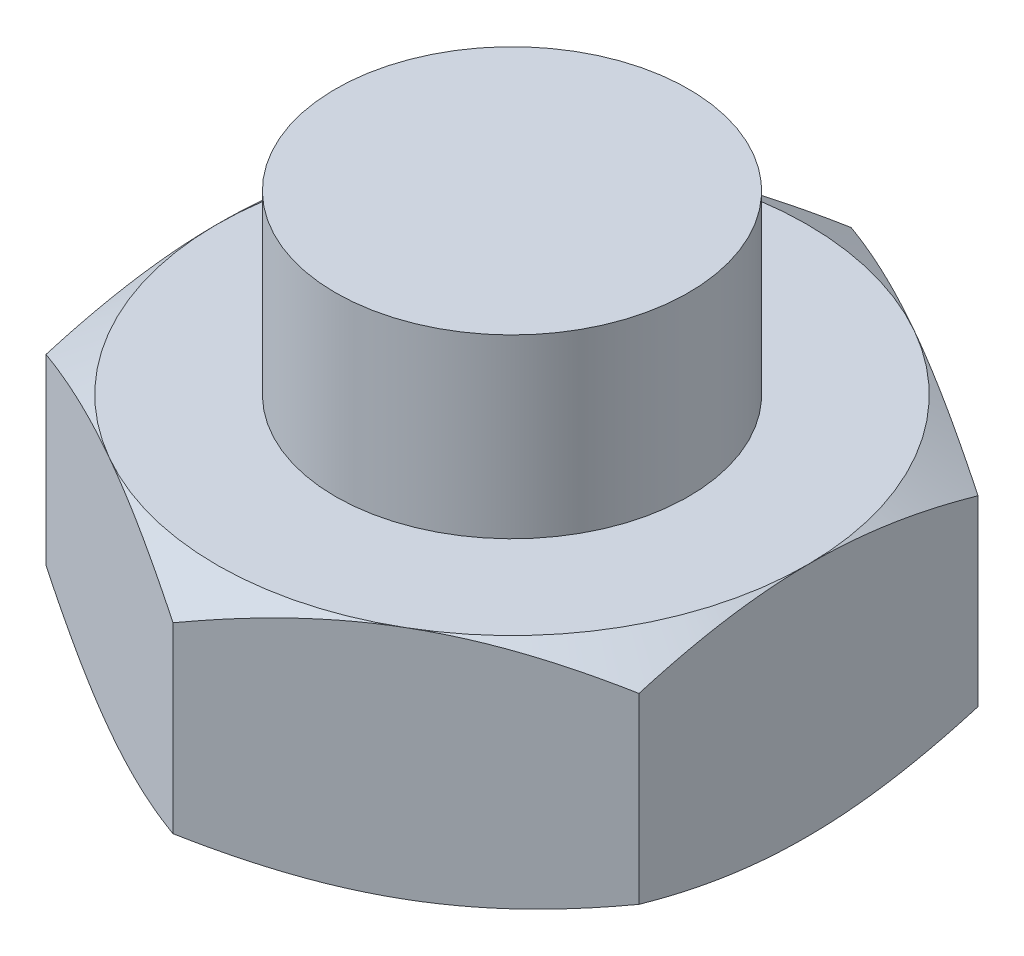
ISO-10303-21;
HEADER;
FILE_DESCRIPTION(('STEP AP214'),'2;1');
FILE_NAME('part.step','',(''),(''),'','','');
FILE_SCHEMA(('AUTOMOTIVE_DESIGN { 1 0 10303 214 1 1 1 1 }'));
ENDSEC;
DATA;
#1=APPLICATION_CONTEXT('core data for automotive mechanical design processes');
#2=APPLICATION_PROTOCOL_DEFINITION('international standard','automotive_design',2000,#1);
#3=PRODUCT_CONTEXT('',#1,'mechanical');
#4=PRODUCT('Part','Part','',(#3));
#5=PRODUCT_RELATED_PRODUCT_CATEGORY('part','',(#4));
#6=PRODUCT_DEFINITION_FORMATION('','',#4);
#7=PRODUCT_DEFINITION_CONTEXT('part definition',#1,'design');
#8=PRODUCT_DEFINITION('design','',#6,#7);
#9=PRODUCT_DEFINITION_SHAPE('','',#8);
#10=(LENGTH_UNIT() NAMED_UNIT(*) SI_UNIT(.MILLI.,.METRE.));
#11=(NAMED_UNIT(*) PLANE_ANGLE_UNIT() SI_UNIT($,.RADIAN.));
#12=(NAMED_UNIT(*) SI_UNIT($,.STERADIAN.) SOLID_ANGLE_UNIT());
#13=UNCERTAINTY_MEASURE_WITH_UNIT(LENGTH_MEASURE(1.E-05),#10,'distance_accuracy_value','');
#14=(GEOMETRIC_REPRESENTATION_CONTEXT(3) GLOBAL_UNCERTAINTY_ASSIGNED_CONTEXT((#13)) GLOBAL_UNIT_ASSIGNED_CONTEXT((#10,
#11,#12)) REPRESENTATION_CONTEXT('',''));
#15=CARTESIAN_POINT('',(0.,0.,0.));
#16=DIRECTION('',(0.,0.,1.));
#17=DIRECTION('',(1.,0.,0.));
#18=AXIS2_PLACEMENT_3D('',#15,#16,#17);
#19=CARTESIAN_POINT('',(0.,4.,0.));
#20=DIRECTION('',(0.,1.,0.));
#21=DIRECTION('',(0.,0.,1.));
#22=AXIS2_PLACEMENT_3D('',#19,#20,#21);
#23=PLANE('',#22);
#24=CARTESIAN_POINT('',(0.,4.,0.));
#25=DIRECTION('',(0.,1.,0.));
#26=DIRECTION('',(0.,0.,1.));
#27=AXIS2_PLACEMENT_3D('',#24,#25,#26);
#28=CIRCLE('',#27,5.01430599676595);
#29=CARTESIAN_POINT('',(-2.48575470841264,4.,4.35480058772011));
#30=VERTEX_POINT('',#29);
#31=CARTESIAN_POINT('',(2.5284905831747,4.,4.33012701892218));
#32=VERTEX_POINT('',#31);
#33=EDGE_CURVE('E171',#30,#32,#28,.T.);
#34=ORIENTED_EDGE('',*,*,#33,.T.);
#35=CARTESIAN_POINT('',(0.,4.,0.));
#36=DIRECTION('',(0.,1.,0.));
#37=DIRECTION('',(0.,0.,1.));
#38=AXIS2_PLACEMENT_3D('',#35,#36,#37);
#39=CIRCLE('',#38,5.01430599676595);
#40=CARTESIAN_POINT('',(5.01424529158734,4.,-0.0246735687979292));
#41=VERTEX_POINT('',#40);
#42=EDGE_CURVE('E252',#32,#41,#39,.T.);
#43=ORIENTED_EDGE('',*,*,#42,.T.);
#44=CARTESIAN_POINT('',(2.48575470841264,4.,-4.35480058772011));
#45=VERTEX_POINT('',#44);
#46=EDGE_CURVE('E173',#41,#45,#28,.T.);
#47=ORIENTED_EDGE('',*,*,#46,.T.);
#48=CARTESIAN_POINT('',(-2.5284905831747,4.,-4.33012701892218));
#49=VERTEX_POINT('',#48);
#50=EDGE_CURVE('E180',#45,#49,#28,.T.);
#51=ORIENTED_EDGE('',*,*,#50,.T.);
#52=CARTESIAN_POINT('',(-5.01424529158734,4.,0.02467356879793));
#53=VERTEX_POINT('',#52);
#54=EDGE_CURVE('E178',#49,#53,#28,.T.);
#55=ORIENTED_EDGE('',*,*,#54,.T.);
#56=EDGE_CURVE('E172',#53,#30,#28,.T.);
#57=ORIENTED_EDGE('',*,*,#56,.T.);
#58=EDGE_LOOP('',(#34,#43,#47,#51,#55,#57));
#59=FACE_BOUND('',#58,.T.);
#60=CARTESIAN_POINT('',(0.,4.,0.));
#61=DIRECTION('',(0.,1.,0.));
#62=DIRECTION('',(0.,0.,1.));
#63=AXIS2_PLACEMENT_3D('',#60,#61,#62);
#64=CIRCLE('',#63,3.);
#65=CARTESIAN_POINT('',(0.,4.,3.));
#66=VERTEX_POINT('',#65);
#67=EDGE_CURVE('E483',#66,#66,#64,.T.);
#68=ORIENTED_EDGE('',*,*,#67,.F.);
#69=EDGE_LOOP('',(#68));
#70=FACE_BOUND('',#69,.T.);
#71=ADVANCED_FACE('F35',(#59,#70),#23,.T.);
#72=CARTESIAN_POINT('',(5.02849058317469,4.,2.87030230008283));
#73=DIRECTION('',(-0.999987893603092,0.,0.00492063484235761));
#74=DIRECTION('',(0.00492063484235761,0.,0.999987893603092));
#75=AXIS2_PLACEMENT_3D('',#72,#73,#74);
#76=PLANE('',#75);
#77=CARTESIAN_POINT('',(4.9999990158611,0.447917484700277,-2.91984943767869));
#78=CARTESIAN_POINT('',(5.00125108658539,0.374446528137613,-2.66539943146302));
#79=CARTESIAN_POINT('',(5.00251386630712,0.307621421446591,-2.40877310691777));
#80=CARTESIAN_POINT('',(5.00506129162112,0.190977949349087,-1.89107680238245));
#81=CARTESIAN_POINT('',(5.00634598247228,0.14120084471822,-1.62999762472705));
#82=CARTESIAN_POINT('',(5.00889963872586,0.0637294768664885,-1.11103504778139));
#83=CARTESIAN_POINT('',(5.01016820644773,0.0355191827968383,-0.853232466462973));
#84=CARTESIAN_POINT('',(5.01207552012836,0.0102227694877358,-0.465621792020172));
#85=CARTESIAN_POINT('',(5.01271172642389,0.00462573641110162,-0.336329817762157));
#86=CARTESIAN_POINT('',(5.01398472688311,-0.000800215533808021,-0.0776264007129085));
#87=CARTESIAN_POINT('',(5.01462152102803,-0.000629312581884306,0.0517850382643947));
#88=CARTESIAN_POINT('',(5.01636613881153,0.00777692395854868,0.406332107566666));
#89=CARTESIAN_POINT('',(5.01747338430081,0.0218934907406079,0.631350244454539));
#90=CARTESIAN_POINT('',(5.01968052664195,0.0666562759325538,1.07989310351669));
#91=CARTESIAN_POINT('',(5.02078041573633,0.0973177942957524,1.30341624919304));
#92=CARTESIAN_POINT('',(5.02299200456623,0.173963342665548,1.75286273859509));
#93=CARTESIAN_POINT('',(5.0241034251966,0.220272131434008,1.97872936163798));
#94=CARTESIAN_POINT('',(5.02630969163108,0.325374511175889,2.42709421601792));
#95=CARTESIAN_POINT('',(5.02740456569219,0.384143412596234,2.6495981898347));
#96=CARTESIAN_POINT('',(5.02849156731357,0.447917484700276,2.87050230008283));
#97=B_SPLINE_CURVE_WITH_KNOTS('',3,(#77,#78,#79,#80,#81,#82,#83,#84,#85,#86,#87,#88,#89,#90,#91,
#92,#93,#94,#95,#96),.UNSPECIFIED.,.F.,.F.,(4,2,2,2,2,2,2,2,2,4),(0.,0.794821338024906,
1.59155298495652,2.36856665618577,2.75669843208432,3.14481821804768,3.82050145746416,
4.49681060885583,5.18811978674575,5.87807173689202),.UNSPECIFIED.);
#98=CARTESIAN_POINT('',(4.99999999999998,0.447859747478655,-2.91964943767869));
#99=VERTEX_POINT('',#98);
#100=CARTESIAN_POINT('',(5.01424529158734,0.,-0.0246735687979292));
#101=VERTEX_POINT('',#100);
#102=EDGE_CURVE('E52',#99,#101,#97,.T.);
#103=ORIENTED_EDGE('',*,*,#102,.F.);
#104=DIRECTION('',(0.,-1.,0.));
#105=VECTOR('',#104,1.);
#106=CARTESIAN_POINT('',(4.99999999999998,4.,-2.91964943767869));
#107=LINE('',#106,#105);
#108=CARTESIAN_POINT('',(4.99999999999998,3.55214025252135,-2.91964943767869));
#109=VERTEX_POINT('',#108);
#110=EDGE_CURVE('E169',#109,#99,#107,.T.);
#111=ORIENTED_EDGE('',*,*,#110,.F.);
#112=CARTESIAN_POINT('',(5.02849156731357,3.55208251529972,2.87050230008283));
#113=CARTESIAN_POINT('',(5.02723949658928,3.62555347186239,2.61605229386716));
#114=CARTESIAN_POINT('',(5.02597671686755,3.69237857855341,2.35942596932191));
#115=CARTESIAN_POINT('',(5.02342929155355,3.80902205065091,1.84172966478659));
#116=CARTESIAN_POINT('',(5.02214460070239,3.85879915528178,1.58065048713119));
#117=CARTESIAN_POINT('',(5.01959094444881,3.93627052313351,1.06168791018553));
#118=CARTESIAN_POINT('',(5.01832237672694,3.96448081720316,0.803885328867112));
#119=CARTESIAN_POINT('',(5.01641506304631,3.98977723051226,0.416274654424311));
#120=CARTESIAN_POINT('',(5.01577885675078,3.9953742635889,0.286982680166297));
#121=CARTESIAN_POINT('',(5.01450585629156,4.00080021553381,0.028279263117048));
#122=CARTESIAN_POINT('',(5.01386906214664,4.00062931258188,-0.101132175860255));
#123=CARTESIAN_POINT('',(5.01212444436314,3.99222307604145,-0.455679245162526));
#124=CARTESIAN_POINT('',(5.01101719887386,3.97810650925939,-0.680697382050399));
#125=CARTESIAN_POINT('',(5.00881005653272,3.93334372406745,-1.12924024111255));
#126=CARTESIAN_POINT('',(5.00771016743834,3.90268220570425,-1.3527633867889));
#127=CARTESIAN_POINT('',(5.00549857860844,3.82603665733445,-1.80220987619095));
#128=CARTESIAN_POINT('',(5.00438715797807,3.77972786856599,-2.02807649923384));
#129=CARTESIAN_POINT('',(5.00218089154359,3.67462548882411,-2.47644135361378));
#130=CARTESIAN_POINT('',(5.00108601748248,3.61585658740377,-2.69894532743056));
#131=CARTESIAN_POINT('',(4.9999990158611,3.55208251529972,-2.91984943767869));
#132=B_SPLINE_CURVE_WITH_KNOTS('',3,(#112,#113,#114,#115,#116,#117,#118,#119,#120,#121,#122,
#123,#124,#125,#126,#127,#128,#129,#130,#131),.UNSPECIFIED.,.F.,.F.,(4,2,2,2,2,2,2,2,2,4),(0.,
0.794821338024905,1.59155298495652,2.36856665618577,2.75669843208432,3.14481821804768,
3.82050145746416,4.49681060885583,5.18811978674575,5.87807173689202),.UNSPECIFIED.);
#133=EDGE_CURVE('E239',#41,#109,#132,.T.);
#134=ORIENTED_EDGE('',*,*,#133,.F.);
#135=CARTESIAN_POINT('',(5.02849058317469,3.55214025252135,2.87030230008283));
#136=VERTEX_POINT('',#135);
#137=EDGE_CURVE('E160',#136,#41,#132,.T.);
#138=ORIENTED_EDGE('',*,*,#137,.F.);
#139=DIRECTION('',(0.,-1.,0.));
#140=VECTOR('',#139,1.);
#141=CARTESIAN_POINT('',(5.02849058317469,4.,2.87030230008283));
#142=LINE('',#141,#140);
#143=CARTESIAN_POINT('',(5.02849058317469,0.447859747478654,2.87030230008283));
#144=VERTEX_POINT('',#143);
#145=EDGE_CURVE('E155',#136,#144,#142,.T.);
#146=ORIENTED_EDGE('',*,*,#145,.T.);
#147=EDGE_CURVE('E147',#101,#144,#97,.T.);
#148=ORIENTED_EDGE('',*,*,#147,.F.);
#149=EDGE_LOOP('',(#103,#111,#134,#138,#146,#148));
#150=FACE_BOUND('',#149,.T.);
#151=ADVANCED_FACE('F37',(#150),#76,.F.);
#152=CARTESIAN_POINT('',(4.99999999999998,4.,-2.91964943767869));
#153=DIRECTION('',(-0.495732552025317,0.,0.868475236758347));
#154=DIRECTION('',(0.868475236758347,0.,0.495732552025317));
#155=AXIS2_PLACEMENT_3D('',#152,#153,#154);
#156=PLANE('',#155);
#157=CARTESIAN_POINT('',(-0.0286905831747077,0.447926228072088,-5.79006589934749));
#158=CARTESIAN_POINT('',(0.192296065465768,0.374454553334258,-5.66392496791119));
#159=CARTESIAN_POINT('',(0.415172818406593,0.307628683938442,-5.53670514995199));
#160=CARTESIAN_POINT('',(0.864785619640762,0.190983628851342,-5.28006259764271));
#161=CARTESIAN_POINT('',(1.09152965626008,0.141205704931097,-5.15063530349282));
#162=CARTESIAN_POINT('',(1.54224222213373,0.0637327171769791,-4.89336499680635));
#163=CARTESIAN_POINT('',(1.76614056016625,0.0355216175545699,-4.76556204997579));
#164=CARTESIAN_POINT('',(2.1027756546474,0.0102240367495575,-4.57340806857809));
#165=CARTESIAN_POINT('',(2.21506414638369,0.00462662144995524,-4.50931290706343));
#166=CARTESIAN_POINT('',(2.43974490113167,-0.000800072082288288,-4.38106335056723));
#167=CARTESIAN_POINT('',(2.5521371608308,-0.000629528483201749,-4.31690895747652));
#168=CARTESIAN_POINT('',(2.86006040720272,0.00777586246854357,-4.1411439266604));
#169=CARTESIAN_POINT('',(3.05548936155995,0.0218922835307172,-4.02959152978981));
#170=CARTESIAN_POINT('',(3.44505022864037,0.0666554626951286,-3.80722709769868));
#171=CARTESIAN_POINT('',(3.63918077207081,0.0973175223166123,-3.69641584408132));
#172=CARTESIAN_POINT('',(4.02952650777377,0.173964760147534,-3.47360340275655));
#173=CARTESIAN_POINT('',(4.22569243550712,0.220274718850526,-3.36163033563878));
#174=CARTESIAN_POINT('',(4.61509875558895,0.325379883010159,-3.13935412019999));
#175=CARTESIAN_POINT('',(4.80834413567574,0.384150396705421,-3.02904812483839));
#176=CARTESIAN_POINT('',(5.00019999999998,0.447926228072089,-2.91953527609272));
#177=B_SPLINE_CURVE_WITH_KNOTS('',3,(#157,#158,#159,#160,#161,#162,#163,#164,#165,#166,#167,
#168,#169,#170,#171,#172,#173,#174,#175,#176),.UNSPECIFIED.,.F.,.F.,(4,2,2,2,2,2,2,2,2,4),(0.,
0.794823411774109,1.59155718924444,2.36857273607155,2.75670543860724,3.1448261520024,
3.82052279419409,4.49684539888776,5.18816874193885,5.87813475679396),.UNSPECIFIED.);
#178=CARTESIAN_POINT('',(-0.0284905831747079,0.447859747478655,-5.78995173776152));
#179=VERTEX_POINT('',#178);
#180=CARTESIAN_POINT('',(2.48575470841264,0.,-4.35480058772011));
#181=VERTEX_POINT('',#180);
#182=EDGE_CURVE('E59',#179,#181,#177,.T.);
#183=ORIENTED_EDGE('',*,*,#182,.F.);
#184=DIRECTION('',(0.,-1.,0.));
#185=VECTOR('',#184,1.);
#186=CARTESIAN_POINT('',(-0.0284905831747077,4.,-5.78995173776152));
#187=LINE('',#186,#185);
#188=CARTESIAN_POINT('',(-0.0284905831747076,3.55214025252135,-5.78995173776152));
#189=VERTEX_POINT('',#188);
#190=EDGE_CURVE('E166',#189,#179,#187,.T.);
#191=ORIENTED_EDGE('',*,*,#190,.F.);
#192=CARTESIAN_POINT('',(5.00019999999998,3.55207377192791,-2.91953527609272));
#193=CARTESIAN_POINT('',(4.7792133513595,3.62554544666574,-3.04567620752903));
#194=CARTESIAN_POINT('',(4.55633659841868,3.69237131606156,-3.17289602548823));
#195=CARTESIAN_POINT('',(4.10672379718451,3.80901637114866,-3.42953857779751));
#196=CARTESIAN_POINT('',(3.8799797605652,3.8587942950689,-3.55896587194739));
#197=CARTESIAN_POINT('',(3.42926719469154,3.93626728282302,-3.81623617863386));
#198=CARTESIAN_POINT('',(3.20536885665902,3.96447838244543,-3.94403912546443));
#199=CARTESIAN_POINT('',(2.86873376217788,3.98977596325044,-4.13619310686212));
#200=CARTESIAN_POINT('',(2.75644527044158,3.99537337855004,-4.20028826837678));
#201=CARTESIAN_POINT('',(2.5317645156936,4.00080007208229,-4.32853782487298));
#202=CARTESIAN_POINT('',(2.41937225599447,4.0006295284832,-4.39269221796369));
#203=CARTESIAN_POINT('',(2.11144900962255,3.99222413753146,-4.56845724877982));
#204=CARTESIAN_POINT('',(1.91602005526533,3.97810771646928,-4.68000964565041));
#205=CARTESIAN_POINT('',(1.5264591881849,3.93334453730487,-4.90237407774153));
#206=CARTESIAN_POINT('',(1.33232864475447,3.90268247768339,-5.0131853313589));
#207=CARTESIAN_POINT('',(0.941982909051504,3.82603523985247,-5.23599777268366));
#208=CARTESIAN_POINT('',(0.745816981318151,3.77972528114947,-5.34797083980144));
#209=CARTESIAN_POINT('',(0.356410661236327,3.67462011698984,-5.57024705524022));
#210=CARTESIAN_POINT('',(0.163165281149531,3.61584960329458,-5.68055305060182));
#211=CARTESIAN_POINT('',(-0.0286905831747084,3.55207377192791,-5.79006589934749));
#212=B_SPLINE_CURVE_WITH_KNOTS('',3,(#192,#193,#194,#195,#196,#197,#198,#199,#200,#201,#202,
#203,#204,#205,#206,#207,#208,#209,#210,#211),.UNSPECIFIED.,.F.,.F.,(4,2,2,2,2,2,2,2,2,4),(0.,
0.794823411774109,1.59155718924444,2.36857273607156,2.75670543860725,3.1448261520024,
3.82052279419409,4.49684539888776,5.18816874193885,5.87813475679396),.UNSPECIFIED.);
#213=EDGE_CURVE('E293',#45,#189,#212,.T.);
#214=ORIENTED_EDGE('',*,*,#213,.F.);
#215=EDGE_CURVE('E297',#109,#45,#212,.T.);
#216=ORIENTED_EDGE('',*,*,#215,.F.);
#217=ORIENTED_EDGE('',*,*,#110,.T.);
#218=EDGE_CURVE('E277',#181,#99,#177,.T.);
#219=ORIENTED_EDGE('',*,*,#218,.F.);
#220=EDGE_LOOP('',(#183,#191,#214,#216,#217,#219));
#221=FACE_BOUND('',#220,.T.);
#222=ADVANCED_FACE('F286',(#221),#156,.F.);
#223=CARTESIAN_POINT('',(-0.0284905831747077,4.,-5.78995173776152));
#224=DIRECTION('',(0.504255341577775,0.,0.863554601915989));
#225=DIRECTION('',(0.863554601915989,0.,-0.504255341577775));
#226=AXIS2_PLACEMENT_3D('',#223,#224,#225);
#227=PLANE('',#226);
#228=CARTESIAN_POINT('',(-5.02869058317469,0.447926606897626,-2.87018551410532));
#229=CARTESIAN_POINT('',(-4.8089559886495,0.374454901043448,-2.99849511117412));
#230=CARTESIAN_POINT('',(-4.58734199871511,0.307628998601953,-3.12790214339286));
#231=CARTESIAN_POINT('',(-4.14027658772118,0.190983874928712,-3.38895699855567));
#232=CARTESIAN_POINT('',(-3.91481722358392,0.141205915511134,-3.52060945970022));
#233=CARTESIAN_POINT('',(-3.46665827795118,0.0637328575715192,-3.78230286242168));
#234=CARTESIAN_POINT('',(-3.2440284900705,0.0355217230469225,-3.91230304942095));
#235=CARTESIAN_POINT('',(-2.90930068132805,0.010224091657783,-4.10776062113501));
#236=CARTESIAN_POINT('',(-2.79764838636964,0.00462665979759133,-4.17295773317319));
#237=CARTESIAN_POINT('',(-2.5742406125009,-0.000800065865445418,-4.30341220944297));
#238=CARTESIAN_POINT('',(-2.46248513688438,-0.000629537836063153,-4.36866957175122));
#239=CARTESIAN_POINT('',(-2.15630635232406,0.00777581647830405,-4.54745651498536));
#240=CARTESIAN_POINT('',(-1.96198449720749,0.0218922312264838,-4.66092685398932));
#241=CARTESIAN_POINT('',(-1.574630481177,0.0666554274600818,-4.88711444100652));
#242=CARTESIAN_POINT('',(-1.38159968180313,0.0973175105325956,-4.99983089397584));
#243=CARTESIAN_POINT('',(-0.993465240699849,0.173964821562911,-5.22647419451803));
#244=CARTESIAN_POINT('',(-0.798410584532968,0.220274830955858,-5.34037243795688));
#245=CARTESIAN_POINT('',(-0.411210237815937,0.325380115756476,-5.56647029286915));
#246=CARTESIAN_POINT('',(-0.21905958776662,0.384150699307086,-5.67867280034237));
#247=CARTESIAN_POINT('',(-0.0282905831747069,0.447926606897628,-5.79006852373903));
#248=B_SPLINE_CURVE_WITH_KNOTS('',3,(#228,#229,#230,#231,#232,#233,#234,#235,#236,#237,#238,
#239,#240,#241,#242,#243,#244,#245,#246,#247),.UNSPECIFIED.,.F.,.F.,(4,2,2,2,2,2,2,2,2,4),(0.,
0.794823501623766,1.59155737140428,2.36857299949575,2.75670574218,3.14482649575815,
3.82052371865139,4.49684690623585,5.18817086302087,5.8781374872575),.UNSPECIFIED.);
#249=CARTESIAN_POINT('',(-5.02849058317469,0.447859747478653,-2.87030230008283));
#250=VERTEX_POINT('',#249);
#251=CARTESIAN_POINT('',(-2.5284905831747,0.,-4.33012701892218));
#252=VERTEX_POINT('',#251);
#253=EDGE_CURVE('E306',#250,#252,#248,.T.);
#254=ORIENTED_EDGE('',*,*,#253,.F.);
#255=DIRECTION('',(0.,-1.,0.));
#256=VECTOR('',#255,1.);
#257=CARTESIAN_POINT('',(-5.02849058317469,4.,-2.87030230008283));
#258=LINE('',#257,#256);
#259=CARTESIAN_POINT('',(-5.02849058317469,3.55214025252135,-2.87030230008283));
#260=VERTEX_POINT('',#259);
#261=EDGE_CURVE('E157',#260,#250,#258,.T.);
#262=ORIENTED_EDGE('',*,*,#261,.F.);
#263=CARTESIAN_POINT('',(-0.0282905831747075,3.55207339310237,-5.79006852373903));
#264=CARTESIAN_POINT('',(-0.248025177699891,3.62554509895655,-5.66175892667023));
#265=CARTESIAN_POINT('',(-0.469639167634286,3.69237100139805,-5.53235189445149));
#266=CARTESIAN_POINT('',(-0.916704578628218,3.80901612507129,-5.27129703928868));
#267=CARTESIAN_POINT('',(-1.14216394276548,3.85879408448887,-5.13964457814413));
#268=CARTESIAN_POINT('',(-1.59032288839821,3.93626714242848,-4.87795117542267));
#269=CARTESIAN_POINT('',(-1.81295267627889,3.96447827695308,-4.7479509884234));
#270=CARTESIAN_POINT('',(-2.14768048502134,3.98977590834222,-4.55249341670934));
#271=CARTESIAN_POINT('',(-2.25933277997976,3.99537334020241,-4.48729630467116));
#272=CARTESIAN_POINT('',(-2.4827405538485,4.00080006586545,-4.35684182840138));
#273=CARTESIAN_POINT('',(-2.59449602946501,4.00062953783606,-4.29158446609313));
#274=CARTESIAN_POINT('',(-2.90067481402534,3.9922241835217,-4.11279752285899));
#275=CARTESIAN_POINT('',(-3.09499666914191,3.97810776877352,-3.99932718385503));
#276=CARTESIAN_POINT('',(-3.4823506851724,3.93334457253992,-3.77313959683783));
#277=CARTESIAN_POINT('',(-3.67538148454626,3.90268248946741,-3.66042314386851));
#278=CARTESIAN_POINT('',(-4.06351592564955,3.82603517843709,-3.43377984332632));
#279=CARTESIAN_POINT('',(-4.25857058181643,3.77972516904414,-3.31988159988747));
#280=CARTESIAN_POINT('',(-4.64577092853346,3.67461988424353,-3.0937837449752));
#281=CARTESIAN_POINT('',(-4.83792157858278,3.61584930069292,-2.98158123750198));
#282=CARTESIAN_POINT('',(-5.02869058317469,3.55207339310237,-2.87018551410532));
#283=B_SPLINE_CURVE_WITH_KNOTS('',3,(#263,#264,#265,#266,#267,#268,#269,#270,#271,#272,#273,
#274,#275,#276,#277,#278,#279,#280,#281,#282),.UNSPECIFIED.,.F.,.F.,(4,2,2,2,2,2,2,2,2,4),(0.,
0.794823501623766,1.59155737140428,2.36857299949575,2.75670574218,3.14482649575815,
3.82052371865139,4.49684690623585,5.18817086302087,5.8781374872575),.UNSPECIFIED.);
#284=EDGE_CURVE('E205',#49,#260,#283,.T.);
#285=ORIENTED_EDGE('',*,*,#284,.F.);
#286=EDGE_CURVE('E298',#189,#49,#283,.T.);
#287=ORIENTED_EDGE('',*,*,#286,.F.);
#288=ORIENTED_EDGE('',*,*,#190,.T.);
#289=EDGE_CURVE('E282',#252,#179,#248,.T.);
#290=ORIENTED_EDGE('',*,*,#289,.F.);
#291=EDGE_LOOP('',(#254,#262,#285,#287,#288,#290));
#292=FACE_BOUND('',#291,.T.);
#293=ADVANCED_FACE('F289',(#292),#227,.F.);
#294=CARTESIAN_POINT('',(-5.02849058317469,4.,-2.87030230008283));
#295=DIRECTION('',(0.999987893603092,0.,-0.00492063484235776));
#296=DIRECTION('',(-0.00492063484235776,0.,-0.999987893603092));
#297=AXIS2_PLACEMENT_3D('',#294,#295,#296);
#298=PLANE('',#297);
#299=CARTESIAN_POINT('',(-4.9999990158611,0.447917484700276,2.91984943767869));
#300=CARTESIAN_POINT('',(-5.00125108658539,0.374446528137612,2.66539943146302));
#301=CARTESIAN_POINT('',(-5.00251386630712,0.30762142144659,2.40877310691777));
#302=CARTESIAN_POINT('',(-5.00506129162112,0.190977949349086,1.89107680238245));
#303=CARTESIAN_POINT('',(-5.00634598247228,0.14120084471822,1.62999762472705));
#304=CARTESIAN_POINT('',(-5.00889963872586,0.0637294768664876,1.11103504778139));
#305=CARTESIAN_POINT('',(-5.01016820644773,0.0355191827968375,0.853232466462975));
#306=CARTESIAN_POINT('',(-5.01207552012836,0.010222769487735,0.465621792020174));
#307=CARTESIAN_POINT('',(-5.01271172642389,0.00462573641110095,0.336329817762159));
#308=CARTESIAN_POINT('',(-5.01398472688311,-0.000800215533808893,0.0776264007129104));
#309=CARTESIAN_POINT('',(-5.01462152102803,-0.000629312581885465,-0.0517850382643928));
#310=CARTESIAN_POINT('',(-5.01636613881153,0.00777692395854731,-0.406332107566664));
#311=CARTESIAN_POINT('',(-5.01747338430081,0.0218934907406071,-0.631350244454537));
#312=CARTESIAN_POINT('',(-5.01968052664194,0.0666562759325533,-1.07989310351668));
#313=CARTESIAN_POINT('',(-5.02078041573633,0.0973177942957519,-1.30341624919304));
#314=CARTESIAN_POINT('',(-5.02299200456623,0.173963342665548,-1.75286273859509));
#315=CARTESIAN_POINT('',(-5.0241034251966,0.220272131434007,-1.97872936163798));
#316=CARTESIAN_POINT('',(-5.02630969163108,0.325374511175888,-2.42709421601792));
#317=CARTESIAN_POINT('',(-5.02740456569219,0.384143412596232,-2.64959818983469));
#318=CARTESIAN_POINT('',(-5.02849156731357,0.447917484700275,-2.87050230008283));
#319=B_SPLINE_CURVE_WITH_KNOTS('',3,(#299,#300,#301,#302,#303,#304,#305,#306,#307,#308,#309,
#310,#311,#312,#313,#314,#315,#316,#317,#318),.UNSPECIFIED.,.F.,.F.,(4,2,2,2,2,2,2,2,2,4),(0.,
0.794821338024906,1.59155298495652,2.36856665618577,2.75669843208432,3.14481821804768,
3.82050145746416,4.49681060885583,5.18811978674575,5.87807173689202),.UNSPECIFIED.);
#320=CARTESIAN_POINT('',(-4.99999999999998,0.447859747478655,2.91964943767869));
#321=VERTEX_POINT('',#320);
#322=CARTESIAN_POINT('',(-5.01424529158734,0.,0.02467356879793));
#323=VERTEX_POINT('',#322);
#324=EDGE_CURVE('E272',#321,#323,#319,.T.);
#325=ORIENTED_EDGE('',*,*,#324,.F.);
#326=DIRECTION('',(0.,-1.,0.));
#327=VECTOR('',#326,1.);
#328=CARTESIAN_POINT('',(-4.99999999999998,4.,2.91964943767869));
#329=LINE('',#328,#327);
#330=CARTESIAN_POINT('',(-4.99999999999998,3.55214025252135,2.91964943767869));
#331=VERTEX_POINT('',#330);
#332=EDGE_CURVE('E154',#331,#321,#329,.T.);
#333=ORIENTED_EDGE('',*,*,#332,.F.);
#334=CARTESIAN_POINT('',(-5.02849156731357,3.55208251529973,-2.87050230008283));
#335=CARTESIAN_POINT('',(-5.02723949658928,3.62555347186239,-2.61605229386716));
#336=CARTESIAN_POINT('',(-5.02597671686755,3.69237857855341,-2.3594259693219));
#337=CARTESIAN_POINT('',(-5.02342929155355,3.80902205065091,-1.84172966478659));
#338=CARTESIAN_POINT('',(-5.02214460070239,3.85879915528178,-1.58065048713119));
#339=CARTESIAN_POINT('',(-5.01959094444881,3.93627052313351,-1.06168791018552));
#340=CARTESIAN_POINT('',(-5.01832237672694,3.96448081720316,-0.80388532886711));
#341=CARTESIAN_POINT('',(-5.01641506304631,3.98977723051227,-0.41627465442431));
#342=CARTESIAN_POINT('',(-5.01577885675077,3.9953742635889,-0.286982680166295));
#343=CARTESIAN_POINT('',(-5.01450585629156,4.00080021553381,-0.0282792631170463));
#344=CARTESIAN_POINT('',(-5.01386906214664,4.00062931258188,0.101132175860257));
#345=CARTESIAN_POINT('',(-5.01212444436314,3.99222307604145,0.455679245162528));
#346=CARTESIAN_POINT('',(-5.01101719887385,3.97810650925939,0.680697382050401));
#347=CARTESIAN_POINT('',(-5.00881005653272,3.93334372406745,1.12924024111255));
#348=CARTESIAN_POINT('',(-5.00771016743834,3.90268220570425,1.3527633867889));
#349=CARTESIAN_POINT('',(-5.00549857860844,3.82603665733445,1.80220987619095));
#350=CARTESIAN_POINT('',(-5.00438715797807,3.77972786856599,2.02807649923384));
#351=CARTESIAN_POINT('',(-5.00218089154358,3.67462548882411,2.47644135361379));
#352=CARTESIAN_POINT('',(-5.00108601748248,3.61585658740377,2.69894532743056));
#353=CARTESIAN_POINT('',(-4.9999990158611,3.55208251529972,2.91984943767869));
#354=B_SPLINE_CURVE_WITH_KNOTS('',3,(#334,#335,#336,#337,#338,#339,#340,#341,#342,#343,#344,
#345,#346,#347,#348,#349,#350,#351,#352,#353),.UNSPECIFIED.,.F.,.F.,(4,2,2,2,2,2,2,2,2,4),(0.,
0.794821338024905,1.59155298495652,2.36856665618577,2.75669843208432,3.14481821804768,
3.82050145746416,4.49681060885583,5.18811978674575,5.87807173689202),.UNSPECIFIED.);
#355=EDGE_CURVE('E196',#53,#331,#354,.T.);
#356=ORIENTED_EDGE('',*,*,#355,.F.);
#357=EDGE_CURVE('E199',#260,#53,#354,.T.);
#358=ORIENTED_EDGE('',*,*,#357,.F.);
#359=ORIENTED_EDGE('',*,*,#261,.T.);
#360=EDGE_CURVE('E278',#323,#250,#319,.T.);
#361=ORIENTED_EDGE('',*,*,#360,.F.);
#362=EDGE_LOOP('',(#325,#333,#356,#358,#359,#361));
#363=FACE_BOUND('',#362,.T.);
#364=ADVANCED_FACE('F198',(#363),#298,.F.);
#365=CARTESIAN_POINT('',(-4.99999999999998,4.,2.91964943767869));
#366=DIRECTION('',(0.495732552025317,0.,-0.868475236758347));
#367=DIRECTION('',(-0.868475236758347,0.,-0.495732552025317));
#368=AXIS2_PLACEMENT_3D('',#365,#366,#367);
#369=PLANE('',#368);
#370=CARTESIAN_POINT('',(0.0286905831747081,0.447926228072088,5.79006589934749));
#371=CARTESIAN_POINT('',(-0.192296065465768,0.374454553334259,5.66392496791119));
#372=CARTESIAN_POINT('',(-0.415172818406594,0.307628683938443,5.53670514995199));
#373=CARTESIAN_POINT('',(-0.864785619640762,0.190983628851342,5.28006259764271));
#374=CARTESIAN_POINT('',(-1.09152965626008,0.141205704931096,5.15063530349282));
#375=CARTESIAN_POINT('',(-1.54224222213373,0.063732717176979,4.89336499680635));
#376=CARTESIAN_POINT('',(-1.76614056016625,0.0355216175545702,4.76556204997579));
#377=CARTESIAN_POINT('',(-2.1027756546474,0.0102240367495579,4.57340806857809));
#378=CARTESIAN_POINT('',(-2.21506414638369,0.00462662144995558,4.50931290706343));
#379=CARTESIAN_POINT('',(-2.43974490113167,-0.000800072082288124,4.38106335056723));
#380=CARTESIAN_POINT('',(-2.5521371608308,-0.000629528483201724,4.31690895747652));
#381=CARTESIAN_POINT('',(-2.86006040720272,0.00777586246854352,4.1411439266604));
#382=CARTESIAN_POINT('',(-3.05548936155995,0.0218922835307175,4.02959152978981));
#383=CARTESIAN_POINT('',(-3.44505022864037,0.066655462695129,3.80722709769868));
#384=CARTESIAN_POINT('',(-3.6391807720708,0.0973175223166124,3.69641584408132));
#385=CARTESIAN_POINT('',(-4.02952650777377,0.173964760147534,3.47360340275656));
#386=CARTESIAN_POINT('',(-4.22569243550712,0.220274718850525,3.36163033563878));
#387=CARTESIAN_POINT('',(-4.61509875558894,0.325379883010158,3.13935412019999));
#388=CARTESIAN_POINT('',(-4.80834413567574,0.38415039670542,3.02904812483839));
#389=CARTESIAN_POINT('',(-5.00019999999998,0.447926228072088,2.91953527609272));
#390=B_SPLINE_CURVE_WITH_KNOTS('',3,(#370,#371,#372,#373,#374,#375,#376,#377,#378,#379,#380,
#381,#382,#383,#384,#385,#386,#387,#388,#389),.UNSPECIFIED.,.F.,.F.,(4,2,2,2,2,2,2,2,2,4),(0.,
0.794823411774109,1.59155718924444,2.36857273607155,2.75670543860724,3.1448261520024,
3.82052279419409,4.49684539888776,5.18816874193885,5.87813475679396),.UNSPECIFIED.);
#391=CARTESIAN_POINT('',(0.0284905831747081,0.447859747478655,5.78995173776152));
#392=VERTEX_POINT('',#391);
#393=CARTESIAN_POINT('',(-2.48575470841264,0.,4.35480058772011));
#394=VERTEX_POINT('',#393);
#395=EDGE_CURVE('E130',#392,#394,#390,.T.);
#396=ORIENTED_EDGE('',*,*,#395,.F.);
#397=DIRECTION('',(0.,-1.,0.));
#398=VECTOR('',#397,1.);
#399=CARTESIAN_POINT('',(0.0284905831747081,4.,5.78995173776152));
#400=LINE('',#399,#398);
#401=CARTESIAN_POINT('',(0.0284905831747081,3.55214025252134,5.78995173776152));
#402=VERTEX_POINT('',#401);
#403=EDGE_CURVE('E144',#402,#392,#400,.T.);
#404=ORIENTED_EDGE('',*,*,#403,.F.);
#405=CARTESIAN_POINT('',(-5.00019999999998,3.55207377192791,2.91953527609272));
#406=CARTESIAN_POINT('',(-4.7792133513595,3.62554544666574,3.04567620752903));
#407=CARTESIAN_POINT('',(-4.55633659841868,3.69237131606156,3.17289602548823));
#408=CARTESIAN_POINT('',(-4.10672379718451,3.80901637114866,3.42953857779751));
#409=CARTESIAN_POINT('',(-3.8799797605652,3.8587942950689,3.55896587194739));
#410=CARTESIAN_POINT('',(-3.42926719469154,3.93626728282302,3.81623617863387));
#411=CARTESIAN_POINT('',(-3.20536885665902,3.96447838244543,3.94403912546443));
#412=CARTESIAN_POINT('',(-2.86873376217787,3.98977596325044,4.13619310686212));
#413=CARTESIAN_POINT('',(-2.75644527044158,3.99537337855004,4.20028826837678));
#414=CARTESIAN_POINT('',(-2.5317645156936,4.00080007208229,4.32853782487298));
#415=CARTESIAN_POINT('',(-2.41937225599447,4.0006295284832,4.39269221796369));
#416=CARTESIAN_POINT('',(-2.11144900962255,3.99222413753146,4.56845724877982));
#417=CARTESIAN_POINT('',(-1.91602005526533,3.97810771646928,4.68000964565041));
#418=CARTESIAN_POINT('',(-1.5264591881849,3.93334453730487,4.90237407774153));
#419=CARTESIAN_POINT('',(-1.33232864475447,3.90268247768339,5.01318533135889));
#420=CARTESIAN_POINT('',(-0.941982909051503,3.82603523985247,5.23599777268366));
#421=CARTESIAN_POINT('',(-0.745816981318151,3.77972528114947,5.34797083980144));
#422=CARTESIAN_POINT('',(-0.356410661236327,3.67462011698984,5.57024705524022));
#423=CARTESIAN_POINT('',(-0.163165281149531,3.61584960329458,5.68055305060182));
#424=CARTESIAN_POINT('',(0.0286905831747086,3.55207377192791,5.79006589934749));
#425=B_SPLINE_CURVE_WITH_KNOTS('',3,(#405,#406,#407,#408,#409,#410,#411,#412,#413,#414,#415,
#416,#417,#418,#419,#420,#421,#422,#423,#424),.UNSPECIFIED.,.F.,.F.,(4,2,2,2,2,2,2,2,2,4),(0.,
0.794823411774109,1.59155718924444,2.36857273607155,2.75670543860724,3.1448261520024,
3.82052279419408,4.49684539888776,5.18816874193885,5.87813475679396),.UNSPECIFIED.);
#426=EDGE_CURVE('E206',#30,#402,#425,.T.);
#427=ORIENTED_EDGE('',*,*,#426,.F.);
#428=EDGE_CURVE('E203',#331,#30,#425,.T.);
#429=ORIENTED_EDGE('',*,*,#428,.F.);
#430=ORIENTED_EDGE('',*,*,#332,.T.);
#431=EDGE_CURVE('E146',#394,#321,#390,.T.);
#432=ORIENTED_EDGE('',*,*,#431,.F.);
#433=EDGE_LOOP('',(#396,#404,#427,#429,#430,#432));
#434=FACE_BOUND('',#433,.T.);
#435=ADVANCED_FACE('F142',(#434),#369,.F.);
#436=CARTESIAN_POINT('',(0.0284905831747081,4.,5.78995173776152));
#437=DIRECTION('',(-0.504255341577775,0.,-0.863554601915989));
#438=DIRECTION('',(-0.863554601915989,0.,0.504255341577775));
#439=AXIS2_PLACEMENT_3D('',#436,#437,#438);
#440=PLANE('',#439);
#441=CARTESIAN_POINT('',(5.02869058317469,0.447926606897627,2.87018551410532));
#442=CARTESIAN_POINT('',(4.8089559886495,0.374454901043449,2.99849511117413));
#443=CARTESIAN_POINT('',(4.58734199871511,0.307628998601954,3.12790214339286));
#444=CARTESIAN_POINT('',(4.14027658772118,0.190983874928713,3.38895699855567));
#445=CARTESIAN_POINT('',(3.91481722358392,0.141205915511135,3.52060945970022));
#446=CARTESIAN_POINT('',(3.46665827795118,0.0637328575715202,3.78230286242168));
#447=CARTESIAN_POINT('',(3.2440284900705,0.0355217230469236,3.91230304942095));
#448=CARTESIAN_POINT('',(2.90930068132805,0.0102240916577841,4.10776062113501));
#449=CARTESIAN_POINT('',(2.79764838636963,0.00462665979759228,4.17295773317319));
#450=CARTESIAN_POINT('',(2.5742406125009,-0.000800065865444331,4.30341220944297));
#451=CARTESIAN_POINT('',(2.46248513688438,-0.000629537836061869,4.36866957175123));
#452=CARTESIAN_POINT('',(2.15630635232406,0.0077758164783056,4.54745651498537));
#453=CARTESIAN_POINT('',(1.96198449720748,0.0218922312264852,4.66092685398932));
#454=CARTESIAN_POINT('',(1.57463048117699,0.066655427460083,4.88711444100653));
#455=CARTESIAN_POINT('',(1.38159968180313,0.0973175105325968,4.99983089397584));
#456=CARTESIAN_POINT('',(0.993465240699848,0.173964821562912,5.22647419451803));
#457=CARTESIAN_POINT('',(0.798410584532968,0.220274830955859,5.34037243795688));
#458=CARTESIAN_POINT('',(0.411210237815937,0.325380115756476,5.56647029286915));
#459=CARTESIAN_POINT('',(0.21905958776662,0.384150699307086,5.67867280034237));
#460=CARTESIAN_POINT('',(0.0282905831747073,0.447926606897628,5.79006852373903));
#461=B_SPLINE_CURVE_WITH_KNOTS('',3,(#441,#442,#443,#444,#445,#446,#447,#448,#449,#450,#451,
#452,#453,#454,#455,#456,#457,#458,#459,#460),.UNSPECIFIED.,.F.,.F.,(4,2,2,2,2,2,2,2,2,4),(0.,
0.794823501623766,1.59155737140428,2.36857299949575,2.75670574218,3.14482649575815,
3.82052371865139,4.49684690623585,5.18817086302087,5.8781374872575),.UNSPECIFIED.);
#462=CARTESIAN_POINT('',(2.5284905831747,0.,4.33012701892218));
#463=VERTEX_POINT('',#462);
#464=EDGE_CURVE('E136',#144,#463,#461,.T.);
#465=ORIENTED_EDGE('',*,*,#464,.F.);
#466=ORIENTED_EDGE('',*,*,#145,.F.);
#467=CARTESIAN_POINT('',(0.0282905831747079,3.55207339310237,5.79006852373903));
#468=CARTESIAN_POINT('',(0.248025177699892,3.62554509895655,5.66175892667023));
#469=CARTESIAN_POINT('',(0.469639167634287,3.69237100139805,5.53235189445149));
#470=CARTESIAN_POINT('',(0.916704578628219,3.80901612507129,5.27129703928868));
#471=CARTESIAN_POINT('',(1.14216394276548,3.85879408448886,5.13964457814413));
#472=CARTESIAN_POINT('',(1.59032288839821,3.93626714242848,4.87795117542268));
#473=CARTESIAN_POINT('',(1.81295267627889,3.96447827695308,4.7479509884234));
#474=CARTESIAN_POINT('',(2.14768048502134,3.98977590834222,4.55249341670934));
#475=CARTESIAN_POINT('',(2.25933277997976,3.99537334020241,4.48729630467116));
#476=CARTESIAN_POINT('',(2.4827405538485,4.00080006586544,4.35684182840138));
#477=CARTESIAN_POINT('',(2.59449602946501,4.00062953783606,4.29158446609313));
#478=CARTESIAN_POINT('',(2.90067481402534,3.9922241835217,4.11279752285899));
#479=CARTESIAN_POINT('',(3.09499666914191,3.97810776877352,3.99932718385503));
#480=CARTESIAN_POINT('',(3.4823506851724,3.93334457253992,3.77313959683783));
#481=CARTESIAN_POINT('',(3.67538148454627,3.9026824894674,3.66042314386851));
#482=CARTESIAN_POINT('',(4.06351592564955,3.82603517843709,3.43377984332633));
#483=CARTESIAN_POINT('',(4.25857058181643,3.77972516904414,3.31988159988748));
#484=CARTESIAN_POINT('',(4.64577092853346,3.67461988424352,3.0937837449752));
#485=CARTESIAN_POINT('',(4.83792157858278,3.61584930069291,2.98158123750198));
#486=CARTESIAN_POINT('',(5.02869058317469,3.55207339310237,2.87018551410532));
#487=B_SPLINE_CURVE_WITH_KNOTS('',3,(#467,#468,#469,#470,#471,#472,#473,#474,#475,#476,#477,
#478,#479,#480,#481,#482,#483,#484,#485,#486),.UNSPECIFIED.,.F.,.F.,(4,2,2,2,2,2,2,2,2,4),(0.,
0.794823501623766,1.59155737140428,2.36857299949575,2.75670574218,3.14482649575815,
3.82052371865139,4.49684690623585,5.18817086302087,5.8781374872575),.UNSPECIFIED.);
#488=EDGE_CURVE('E245',#32,#136,#487,.T.);
#489=ORIENTED_EDGE('',*,*,#488,.F.);
#490=EDGE_CURVE('E153',#402,#32,#487,.T.);
#491=ORIENTED_EDGE('',*,*,#490,.F.);
#492=ORIENTED_EDGE('',*,*,#403,.T.);
#493=EDGE_CURVE('E127',#463,#392,#461,.T.);
#494=ORIENTED_EDGE('',*,*,#493,.F.);
#495=EDGE_LOOP('',(#465,#466,#489,#491,#492,#494));
#496=FACE_BOUND('',#495,.T.);
#497=ADVANCED_FACE('F150',(#496),#440,.F.);
#498=CARTESIAN_POINT('',(0.,4.,0.));
#499=DIRECTION('',(0.,-1.,0.));
#500=DIRECTION('',(0.,0.,1.));
#501=AXIS2_PLACEMENT_3D('',#498,#499,#500);
#502=CONICAL_SURFACE('',#501,5.01430599676595,1.0471975511966);
#503=ORIENTED_EDGE('',*,*,#426,.T.);
#504=ORIENTED_EDGE('',*,*,#490,.T.);
#505=ORIENTED_EDGE('',*,*,#33,.F.);
#506=EDGE_LOOP('',(#503,#504,#505));
#507=FACE_BOUND('',#506,.T.);
#508=ADVANCED_FACE('F232',(#507),#502,.T.);
#509=ORIENTED_EDGE('',*,*,#355,.T.);
#510=ORIENTED_EDGE('',*,*,#428,.T.);
#511=ORIENTED_EDGE('',*,*,#56,.F.);
#512=EDGE_LOOP('',(#509,#510,#511));
#513=FACE_BOUND('',#512,.T.);
#514=ADVANCED_FACE('F324',(#513),#502,.T.);
#515=ORIENTED_EDGE('',*,*,#284,.T.);
#516=ORIENTED_EDGE('',*,*,#357,.T.);
#517=ORIENTED_EDGE('',*,*,#54,.F.);
#518=EDGE_LOOP('',(#515,#516,#517));
#519=FACE_BOUND('',#518,.T.);
#520=ADVANCED_FACE('F301',(#519),#502,.T.);
#521=ORIENTED_EDGE('',*,*,#213,.T.);
#522=ORIENTED_EDGE('',*,*,#286,.T.);
#523=ORIENTED_EDGE('',*,*,#50,.F.);
#524=EDGE_LOOP('',(#521,#522,#523));
#525=FACE_BOUND('',#524,.T.);
#526=ADVANCED_FACE('F318',(#525),#502,.T.);
#527=ORIENTED_EDGE('',*,*,#133,.T.);
#528=ORIENTED_EDGE('',*,*,#215,.T.);
#529=ORIENTED_EDGE('',*,*,#46,.F.);
#530=EDGE_LOOP('',(#527,#528,#529));
#531=FACE_BOUND('',#530,.T.);
#532=ADVANCED_FACE('F230',(#531),#502,.T.);
#533=ORIENTED_EDGE('',*,*,#137,.T.);
#534=ORIENTED_EDGE('',*,*,#42,.F.);
#535=ORIENTED_EDGE('',*,*,#488,.T.);
#536=EDGE_LOOP('',(#533,#534,#535));
#537=FACE_BOUND('',#536,.T.);
#538=ADVANCED_FACE('F225',(#537),#502,.T.);
#539=CARTESIAN_POINT('',(0.,0.,0.));
#540=DIRECTION('',(0.,1.,0.));
#541=DIRECTION('',(0.,0.,-1.));
#542=AXIS2_PLACEMENT_3D('',#539,#540,#541);
#543=CONICAL_SURFACE('',#542,5.01430599676595,1.0471975511966);
#544=ORIENTED_EDGE('',*,*,#395,.T.);
#545=CARTESIAN_POINT('',(0.,0.,0.));
#546=DIRECTION('',(0.,1.,0.));
#547=DIRECTION('',(0.,0.,1.));
#548=AXIS2_PLACEMENT_3D('',#545,#546,#547);
#549=CIRCLE('',#548,5.01430599676595);
#550=EDGE_CURVE('E40',#394,#463,#549,.T.);
#551=ORIENTED_EDGE('',*,*,#550,.T.);
#552=ORIENTED_EDGE('',*,*,#493,.T.);
#553=EDGE_LOOP('',(#544,#551,#552));
#554=FACE_BOUND('',#553,.T.);
#555=ADVANCED_FACE('F129',(#554),#543,.T.);
#556=ORIENTED_EDGE('',*,*,#324,.T.);
#557=EDGE_CURVE('E184',#323,#394,#549,.T.);
#558=ORIENTED_EDGE('',*,*,#557,.T.);
#559=ORIENTED_EDGE('',*,*,#431,.T.);
#560=EDGE_LOOP('',(#556,#558,#559));
#561=FACE_BOUND('',#560,.T.);
#562=ADVANCED_FACE('F394',(#561),#543,.T.);
#563=ORIENTED_EDGE('',*,*,#253,.T.);
#564=EDGE_CURVE('E494',#252,#323,#549,.T.);
#565=ORIENTED_EDGE('',*,*,#564,.T.);
#566=ORIENTED_EDGE('',*,*,#360,.T.);
#567=EDGE_LOOP('',(#563,#565,#566));
#568=FACE_BOUND('',#567,.T.);
#569=ADVANCED_FACE('F233',(#568),#543,.T.);
#570=ORIENTED_EDGE('',*,*,#289,.T.);
#571=ORIENTED_EDGE('',*,*,#182,.T.);
#572=EDGE_CURVE('E45',#181,#252,#549,.T.);
#573=ORIENTED_EDGE('',*,*,#572,.T.);
#574=EDGE_LOOP('',(#570,#571,#573));
#575=FACE_BOUND('',#574,.T.);
#576=ADVANCED_FACE('F408',(#575),#543,.T.);
#577=ORIENTED_EDGE('',*,*,#218,.T.);
#578=ORIENTED_EDGE('',*,*,#102,.T.);
#579=CARTESIAN_POINT('',(0.,0.,0.));
#580=DIRECTION('',(0.,-1.,0.));
#581=DIRECTION('',(0.,0.,-1.));
#582=AXIS2_PLACEMENT_3D('',#579,#580,#581);
#583=CIRCLE('',#582,5.01430599676595);
#584=EDGE_CURVE('E137',#181,#101,#583,.T.);
#585=ORIENTED_EDGE('',*,*,#584,.F.);
#586=EDGE_LOOP('',(#577,#578,#585));
#587=FACE_BOUND('',#586,.T.);
#588=ADVANCED_FACE('F402',(#587),#543,.T.);
#589=ORIENTED_EDGE('',*,*,#147,.T.);
#590=ORIENTED_EDGE('',*,*,#464,.T.);
#591=EDGE_CURVE('E12',#463,#101,#549,.T.);
#592=ORIENTED_EDGE('',*,*,#591,.T.);
#593=EDGE_LOOP('',(#589,#590,#592));
#594=FACE_BOUND('',#593,.T.);
#595=ADVANCED_FACE('F395',(#594),#543,.T.);
#596=CARTESIAN_POINT('',(0.,0.,0.));
#597=DIRECTION('',(0.,1.,0.));
#598=DIRECTION('',(0.,0.,1.));
#599=AXIS2_PLACEMENT_3D('',#596,#597,#598);
#600=PLANE('',#599);
#601=ORIENTED_EDGE('',*,*,#591,.F.);
#602=ORIENTED_EDGE('',*,*,#550,.F.);
#603=ORIENTED_EDGE('',*,*,#557,.F.);
#604=ORIENTED_EDGE('',*,*,#564,.F.);
#605=ORIENTED_EDGE('',*,*,#572,.F.);
#606=ORIENTED_EDGE('',*,*,#584,.T.);
#607=EDGE_LOOP('',(#601,#602,#603,#604,#605,#606));
#608=FACE_BOUND('',#607,.T.);
#609=ADVANCED_FACE('F256',(#608),#600,.F.);
#610=CARTESIAN_POINT('',(0.,7.,0.));
#611=DIRECTION('',(0.,-1.,0.));
#612=DIRECTION('',(0.,0.,-1.));
#613=AXIS2_PLACEMENT_3D('',#610,#611,#612);
#614=CYLINDRICAL_SURFACE('',#613,3.);
#615=CARTESIAN_POINT('',(0.,7.,0.));
#616=DIRECTION('',(0.,1.,0.));
#617=DIRECTION('',(0.,0.,1.));
#618=AXIS2_PLACEMENT_3D('',#615,#616,#617);
#619=CIRCLE('',#618,3.);
#620=CARTESIAN_POINT('',(0.,7.,3.));
#621=VERTEX_POINT('',#620);
#622=EDGE_CURVE('E482',#621,#621,#619,.T.);
#623=ORIENTED_EDGE('',*,*,#622,.F.);
#624=EDGE_LOOP('',(#623));
#625=FACE_BOUND('',#624,.T.);
#626=ORIENTED_EDGE('',*,*,#67,.T.);
#627=EDGE_LOOP('',(#626));
#628=FACE_BOUND('',#627,.T.);
#629=ADVANCED_FACE('F430',(#625,#628),#614,.T.);
#630=CARTESIAN_POINT('',(0.,7.,0.));
#631=DIRECTION('',(0.,1.,0.));
#632=DIRECTION('',(0.,0.,1.));
#633=AXIS2_PLACEMENT_3D('',#630,#631,#632);
#634=PLANE('',#633);
#635=ORIENTED_EDGE('',*,*,#622,.T.);
#636=EDGE_LOOP('',(#635));
#637=FACE_BOUND('',#636,.T.);
#638=ADVANCED_FACE('F436',(#637),#634,.T.);
#639=CLOSED_SHELL('',(#71,#151,#222,#293,#364,#435,#497,#508,#514,#520,#526,#532,#538,#555,#562,
#569,#576,#588,#595,#609,#629,#638));
#640=MANIFOLD_SOLID_BREP('B2',#639);
#641=ADVANCED_BREP_SHAPE_REPRESENTATION('',(#18,#640),#14);
#642=SHAPE_DEFINITION_REPRESENTATION(#9,#641);
ENDSEC;
END-ISO-10303-21;
